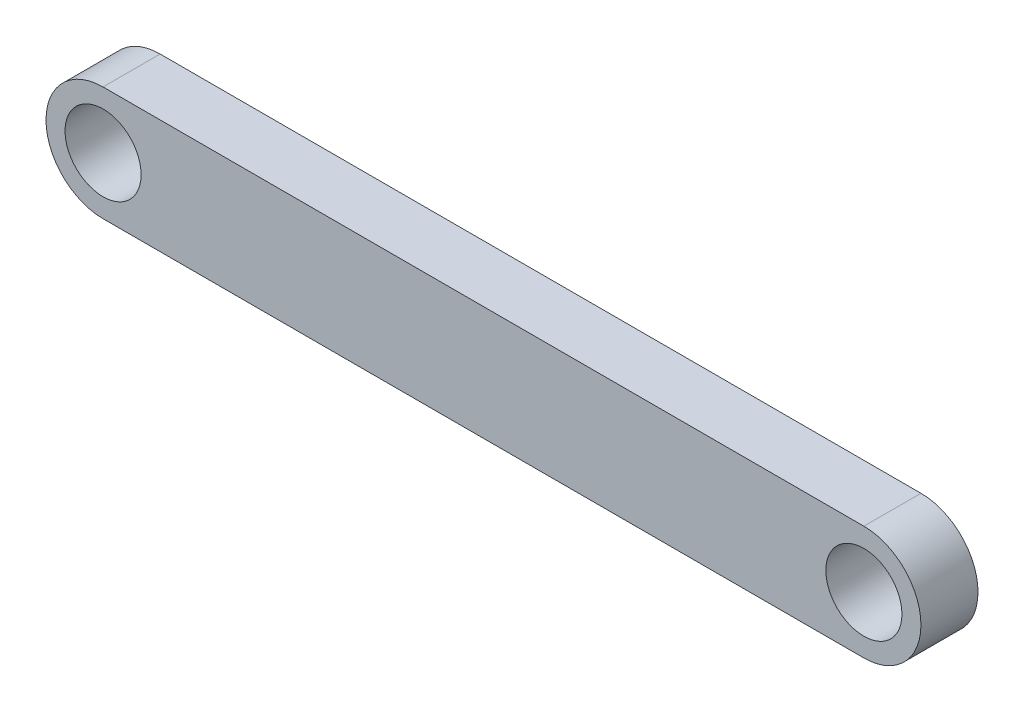
ISO-10303-21;
HEADER;
FILE_DESCRIPTION(('STEP AP214'),'2;1');
FILE_NAME('part.step','',(''),(''),'','','');
FILE_SCHEMA(('AUTOMOTIVE_DESIGN { 1 0 10303 214 1 1 1 1 }'));
ENDSEC;
DATA;
#1=APPLICATION_CONTEXT('core data for automotive mechanical design processes');
#2=APPLICATION_PROTOCOL_DEFINITION('international standard','automotive_design',2000,#1);
#3=PRODUCT_CONTEXT('',#1,'mechanical');
#4=PRODUCT('Part','Part','',(#3));
#5=PRODUCT_RELATED_PRODUCT_CATEGORY('part','',(#4));
#6=PRODUCT_DEFINITION_FORMATION('','',#4);
#7=PRODUCT_DEFINITION_CONTEXT('part definition',#1,'design');
#8=PRODUCT_DEFINITION('design','',#6,#7);
#9=PRODUCT_DEFINITION_SHAPE('','',#8);
#10=(LENGTH_UNIT() NAMED_UNIT(*) SI_UNIT(.MILLI.,.METRE.));
#11=(NAMED_UNIT(*) PLANE_ANGLE_UNIT() SI_UNIT($,.RADIAN.));
#12=(NAMED_UNIT(*) SI_UNIT($,.STERADIAN.) SOLID_ANGLE_UNIT());
#13=UNCERTAINTY_MEASURE_WITH_UNIT(LENGTH_MEASURE(1.E-05),#10,'distance_accuracy_value','');
#14=(GEOMETRIC_REPRESENTATION_CONTEXT(3) GLOBAL_UNCERTAINTY_ASSIGNED_CONTEXT((#13)) GLOBAL_UNIT_ASSIGNED_CONTEXT((#10,
#11,#12)) REPRESENTATION_CONTEXT('',''));
#15=CARTESIAN_POINT('',(0.,0.,0.));
#16=DIRECTION('',(0.,0.,1.));
#17=DIRECTION('',(1.,0.,0.));
#18=AXIS2_PLACEMENT_3D('',#15,#16,#17);
#19=CARTESIAN_POINT('',(-200.,0.0499999999999962,15.));
#20=DIRECTION('',(0.,0.,-1.));
#21=DIRECTION('',(-1.,0.,0.));
#22=AXIS2_PLACEMENT_3D('',#19,#20,#21);
#23=PLANE('',#22);
#24=CARTESIAN_POINT('',(-200.,0.0499999999999962,15.));
#25=DIRECTION('',(0.,0.,1.));
#26=DIRECTION('',(1.,0.,0.));
#27=AXIS2_PLACEMENT_3D('',#24,#25,#26);
#28=CIRCLE('',#27,10.);
#29=CARTESIAN_POINT('',(-190.,0.0499999999999962,15.));
#30=VERTEX_POINT('',#29);
#31=EDGE_CURVE('E85',#30,#30,#28,.T.);
#32=ORIENTED_EDGE('',*,*,#31,.F.);
#33=EDGE_LOOP('',(#32));
#34=FACE_BOUND('',#33,.T.);
#35=CARTESIAN_POINT('',(-200.,0.0499999999999962,15.));
#36=DIRECTION('',(0.,0.,1.));
#37=DIRECTION('',(-1.,0.,0.));
#38=AXIS2_PLACEMENT_3D('',#35,#36,#37);
#39=CIRCLE('',#38,15.);
#40=CARTESIAN_POINT('',(-200.,15.05,15.));
#41=VERTEX_POINT('',#40);
#42=CARTESIAN_POINT('',(-200.,-14.95,15.));
#43=VERTEX_POINT('',#42);
#44=EDGE_CURVE('E95',#41,#43,#39,.T.);
#45=ORIENTED_EDGE('',*,*,#44,.T.);
#46=DIRECTION('',(1.,0.,0.));
#47=VECTOR('',#46,1.);
#48=CARTESIAN_POINT('',(-200.,-14.95,15.));
#49=LINE('',#48,#47);
#50=CARTESIAN_POINT('',(0.,-14.95,15.));
#51=VERTEX_POINT('',#50);
#52=EDGE_CURVE('E80',#43,#51,#49,.T.);
#53=ORIENTED_EDGE('',*,*,#52,.T.);
#54=CARTESIAN_POINT('',(0.,0.0499999999999962,15.));
#55=DIRECTION('',(0.,0.,1.));
#56=DIRECTION('',(1.,0.,0.));
#57=AXIS2_PLACEMENT_3D('',#54,#55,#56);
#58=CIRCLE('',#57,15.);
#59=CARTESIAN_POINT('',(0.,15.05,15.));
#60=VERTEX_POINT('',#59);
#61=EDGE_CURVE('E46',#51,#60,#58,.T.);
#62=ORIENTED_EDGE('',*,*,#61,.T.);
#63=DIRECTION('',(-1.,0.,0.));
#64=VECTOR('',#63,1.);
#65=CARTESIAN_POINT('',(-200.,15.05,15.));
#66=LINE('',#65,#64);
#67=EDGE_CURVE('E41',#60,#41,#66,.T.);
#68=ORIENTED_EDGE('',*,*,#67,.T.);
#69=EDGE_LOOP('',(#45,#53,#62,#68));
#70=FACE_BOUND('',#69,.T.);
#71=CARTESIAN_POINT('',(0.,0.,15.));
#72=DIRECTION('',(0.,0.,1.));
#73=DIRECTION('',(1.,0.,0.));
#74=AXIS2_PLACEMENT_3D('',#71,#72,#73);
#75=CIRCLE('',#74,10.);
#76=CARTESIAN_POINT('',(10.,0.,15.));
#77=VERTEX_POINT('',#76);
#78=EDGE_CURVE('E113',#77,#77,#75,.T.);
#79=ORIENTED_EDGE('',*,*,#78,.F.);
#80=EDGE_LOOP('',(#79));
#81=FACE_BOUND('',#80,.T.);
#82=ADVANCED_FACE('F26',(#34,#70,#81),#23,.F.);
#83=CARTESIAN_POINT('',(-200.,0.0499999999999962,0.));
#84=DIRECTION('',(0.,0.,-1.));
#85=DIRECTION('',(-1.,0.,0.));
#86=AXIS2_PLACEMENT_3D('',#83,#84,#85);
#87=PLANE('',#86);
#88=CARTESIAN_POINT('',(-200.,0.0499999999999962,0.));
#89=DIRECTION('',(0.,0.,1.));
#90=DIRECTION('',(1.,0.,0.));
#91=AXIS2_PLACEMENT_3D('',#88,#89,#90);
#92=CIRCLE('',#91,10.);
#93=CARTESIAN_POINT('',(-190.,0.0499999999999962,0.));
#94=VERTEX_POINT('',#93);
#95=EDGE_CURVE('E88',#94,#94,#92,.T.);
#96=ORIENTED_EDGE('',*,*,#95,.T.);
#97=EDGE_LOOP('',(#96));
#98=FACE_BOUND('',#97,.T.);
#99=CARTESIAN_POINT('',(-200.,0.0499999999999962,0.));
#100=DIRECTION('',(0.,0.,1.));
#101=DIRECTION('',(-1.,0.,0.));
#102=AXIS2_PLACEMENT_3D('',#99,#100,#101);
#103=CIRCLE('',#102,15.);
#104=CARTESIAN_POINT('',(-200.,15.05,0.));
#105=VERTEX_POINT('',#104);
#106=CARTESIAN_POINT('',(-200.,-14.95,0.));
#107=VERTEX_POINT('',#106);
#108=EDGE_CURVE('E72',#105,#107,#103,.T.);
#109=ORIENTED_EDGE('',*,*,#108,.F.);
#110=DIRECTION('',(-1.,0.,0.));
#111=VECTOR('',#110,1.);
#112=CARTESIAN_POINT('',(-200.,15.05,0.));
#113=LINE('',#112,#111);
#114=CARTESIAN_POINT('',(0.,15.05,0.));
#115=VERTEX_POINT('',#114);
#116=EDGE_CURVE('E93',#115,#105,#113,.T.);
#117=ORIENTED_EDGE('',*,*,#116,.F.);
#118=CARTESIAN_POINT('',(0.,0.0499999999999962,0.));
#119=DIRECTION('',(0.,0.,1.));
#120=DIRECTION('',(1.,0.,0.));
#121=AXIS2_PLACEMENT_3D('',#118,#119,#120);
#122=CIRCLE('',#121,15.);
#123=CARTESIAN_POINT('',(0.,-14.95,0.));
#124=VERTEX_POINT('',#123);
#125=EDGE_CURVE('E73',#124,#115,#122,.T.);
#126=ORIENTED_EDGE('',*,*,#125,.F.);
#127=DIRECTION('',(1.,0.,0.));
#128=VECTOR('',#127,1.);
#129=CARTESIAN_POINT('',(-200.,-14.95,0.));
#130=LINE('',#129,#128);
#131=EDGE_CURVE('E67',#107,#124,#130,.T.);
#132=ORIENTED_EDGE('',*,*,#131,.F.);
#133=EDGE_LOOP('',(#109,#117,#126,#132));
#134=FACE_BOUND('',#133,.T.);
#135=CARTESIAN_POINT('',(0.,0.,0.));
#136=DIRECTION('',(0.,0.,1.));
#137=DIRECTION('',(1.,0.,0.));
#138=AXIS2_PLACEMENT_3D('',#135,#136,#137);
#139=CIRCLE('',#138,10.);
#140=CARTESIAN_POINT('',(10.,0.,0.));
#141=VERTEX_POINT('',#140);
#142=EDGE_CURVE('E115',#141,#141,#139,.T.);
#143=ORIENTED_EDGE('',*,*,#142,.T.);
#144=EDGE_LOOP('',(#143));
#145=FACE_BOUND('',#144,.T.);
#146=ADVANCED_FACE('F68',(#98,#134,#145),#87,.T.);
#147=CARTESIAN_POINT('',(-200.,0.0499999999999962,15.));
#148=DIRECTION('',(0.,0.,-1.));
#149=DIRECTION('',(-1.,0.,0.));
#150=AXIS2_PLACEMENT_3D('',#147,#148,#149);
#151=CYLINDRICAL_SURFACE('',#150,15.);
#152=ORIENTED_EDGE('',*,*,#108,.T.);
#153=DIRECTION('',(0.,0.,-1.));
#154=VECTOR('',#153,1.);
#155=CARTESIAN_POINT('',(-200.,-14.95,15.));
#156=LINE('',#155,#154);
#157=EDGE_CURVE('E11',#43,#107,#156,.T.);
#158=ORIENTED_EDGE('',*,*,#157,.F.);
#159=ORIENTED_EDGE('',*,*,#44,.F.);
#160=DIRECTION('',(0.,0.,-1.));
#161=VECTOR('',#160,1.);
#162=CARTESIAN_POINT('',(-200.,15.05,15.));
#163=LINE('',#162,#161);
#164=EDGE_CURVE('E84',#41,#105,#163,.T.);
#165=ORIENTED_EDGE('',*,*,#164,.T.);
#166=EDGE_LOOP('',(#152,#158,#159,#165));
#167=FACE_BOUND('',#166,.T.);
#168=ADVANCED_FACE('F28',(#167),#151,.T.);
#169=CARTESIAN_POINT('',(-200.,-14.95,15.));
#170=DIRECTION('',(0.,1.,0.));
#171=DIRECTION('',(-1.,0.,0.));
#172=AXIS2_PLACEMENT_3D('',#169,#170,#171);
#173=PLANE('',#172);
#174=ORIENTED_EDGE('',*,*,#131,.T.);
#175=DIRECTION('',(0.,0.,-1.));
#176=VECTOR('',#175,1.);
#177=CARTESIAN_POINT('',(0.,-14.95,15.));
#178=LINE('',#177,#176);
#179=EDGE_CURVE('E34',#51,#124,#178,.T.);
#180=ORIENTED_EDGE('',*,*,#179,.F.);
#181=ORIENTED_EDGE('',*,*,#52,.F.);
#182=ORIENTED_EDGE('',*,*,#157,.T.);
#183=EDGE_LOOP('',(#174,#180,#181,#182));
#184=FACE_BOUND('',#183,.T.);
#185=ADVANCED_FACE('F79',(#184),#173,.F.);
#186=CARTESIAN_POINT('',(0.,0.0499999999999962,15.));
#187=DIRECTION('',(0.,0.,-1.));
#188=DIRECTION('',(-1.,0.,0.));
#189=AXIS2_PLACEMENT_3D('',#186,#187,#188);
#190=CYLINDRICAL_SURFACE('',#189,15.);
#191=ORIENTED_EDGE('',*,*,#125,.T.);
#192=DIRECTION('',(0.,0.,-1.));
#193=VECTOR('',#192,1.);
#194=CARTESIAN_POINT('',(0.,15.05,15.));
#195=LINE('',#194,#193);
#196=EDGE_CURVE('E101',#60,#115,#195,.T.);
#197=ORIENTED_EDGE('',*,*,#196,.F.);
#198=ORIENTED_EDGE('',*,*,#61,.F.);
#199=ORIENTED_EDGE('',*,*,#179,.T.);
#200=EDGE_LOOP('',(#191,#197,#198,#199));
#201=FACE_BOUND('',#200,.T.);
#202=ADVANCED_FACE('F104',(#201),#190,.T.);
#203=CARTESIAN_POINT('',(-200.,15.05,15.));
#204=DIRECTION('',(0.,-1.,0.));
#205=DIRECTION('',(0.,0.,-1.));
#206=AXIS2_PLACEMENT_3D('',#203,#204,#205);
#207=PLANE('',#206);
#208=ORIENTED_EDGE('',*,*,#116,.T.);
#209=ORIENTED_EDGE('',*,*,#164,.F.);
#210=ORIENTED_EDGE('',*,*,#67,.F.);
#211=ORIENTED_EDGE('',*,*,#196,.T.);
#212=EDGE_LOOP('',(#208,#209,#210,#211));
#213=FACE_BOUND('',#212,.T.);
#214=ADVANCED_FACE('F106',(#213),#207,.F.);
#215=CARTESIAN_POINT('',(-200.,0.0499999999999962,15.));
#216=DIRECTION('',(0.,0.,-1.));
#217=DIRECTION('',(-1.,0.,0.));
#218=AXIS2_PLACEMENT_3D('',#215,#216,#217);
#219=CYLINDRICAL_SURFACE('',#218,10.);
#220=ORIENTED_EDGE('',*,*,#31,.T.);
#221=EDGE_LOOP('',(#220));
#222=FACE_BOUND('',#221,.T.);
#223=ORIENTED_EDGE('',*,*,#95,.F.);
#224=EDGE_LOOP('',(#223));
#225=FACE_BOUND('',#224,.T.);
#226=ADVANCED_FACE('F124',(#222,#225),#219,.F.);
#227=CARTESIAN_POINT('',(0.,0.,15.));
#228=DIRECTION('',(0.,0.,-1.));
#229=DIRECTION('',(-1.,0.,0.));
#230=AXIS2_PLACEMENT_3D('',#227,#228,#229);
#231=CYLINDRICAL_SURFACE('',#230,10.);
#232=ORIENTED_EDGE('',*,*,#78,.T.);
#233=EDGE_LOOP('',(#232));
#234=FACE_BOUND('',#233,.T.);
#235=ORIENTED_EDGE('',*,*,#142,.F.);
#236=EDGE_LOOP('',(#235));
#237=FACE_BOUND('',#236,.T.);
#238=ADVANCED_FACE('F122',(#234,#237),#231,.F.);
#239=CLOSED_SHELL('',(#82,#146,#168,#185,#202,#214,#226,#238));
#240=MANIFOLD_SOLID_BREP('B2',#239);
#241=ADVANCED_BREP_SHAPE_REPRESENTATION('',(#18,#240),#14);
#242=SHAPE_DEFINITION_REPRESENTATION(#9,#241);
ENDSEC;
END-ISO-10303-21;
